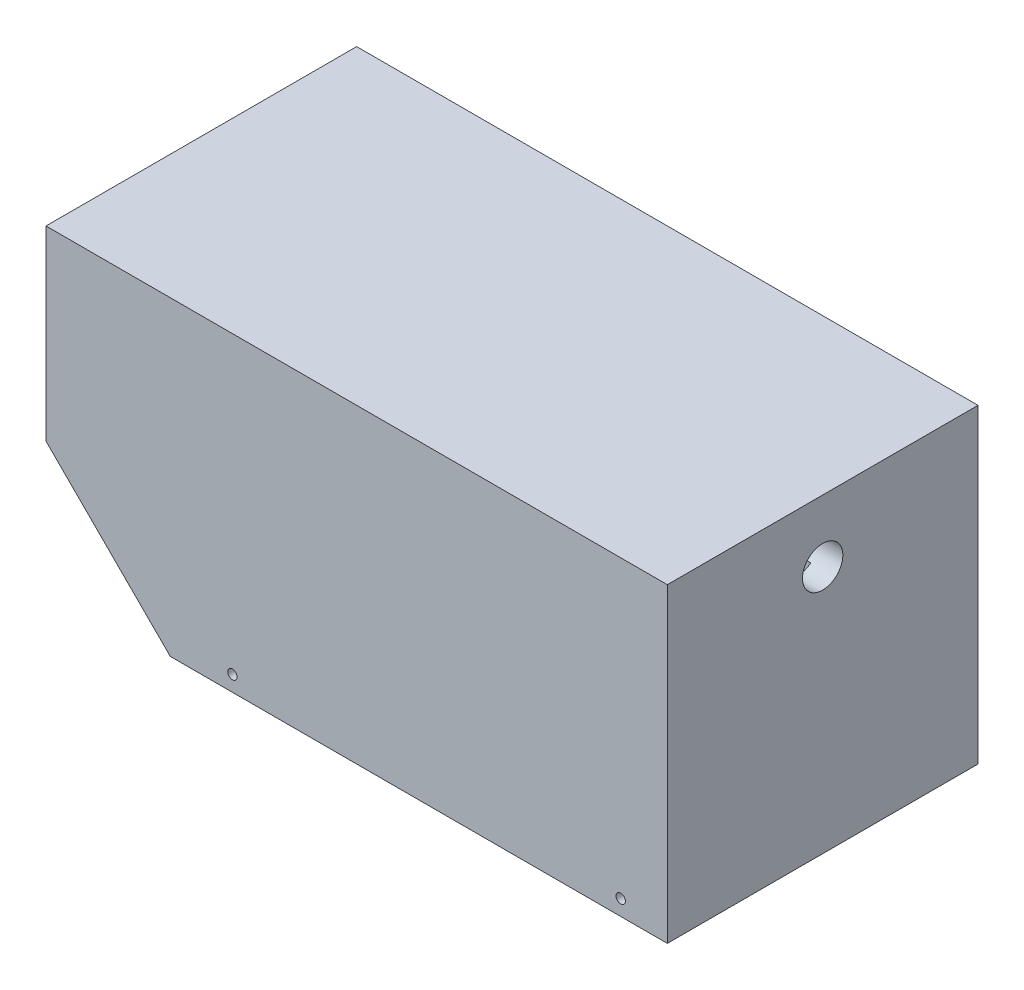
ISO-10303-21;
HEADER;
FILE_DESCRIPTION(('STEP AP214'),'2;1');
FILE_NAME('part.step','',(''),(''),'','','');
FILE_SCHEMA(('AUTOMOTIVE_DESIGN { 1 0 10303 214 1 1 1 1 }'));
ENDSEC;
DATA;
#1=APPLICATION_CONTEXT('core data for automotive mechanical design processes');
#2=APPLICATION_PROTOCOL_DEFINITION('international standard','automotive_design',2000,#1);
#3=PRODUCT_CONTEXT('',#1,'mechanical');
#4=PRODUCT('Part','Part','',(#3));
#5=PRODUCT_RELATED_PRODUCT_CATEGORY('part','',(#4));
#6=PRODUCT_DEFINITION_FORMATION('','',#4);
#7=PRODUCT_DEFINITION_CONTEXT('part definition',#1,'design');
#8=PRODUCT_DEFINITION('design','',#6,#7);
#9=PRODUCT_DEFINITION_SHAPE('','',#8);
#10=(LENGTH_UNIT() NAMED_UNIT(*) SI_UNIT(.MILLI.,.METRE.));
#11=(NAMED_UNIT(*) PLANE_ANGLE_UNIT() SI_UNIT($,.RADIAN.));
#12=(NAMED_UNIT(*) SI_UNIT($,.STERADIAN.) SOLID_ANGLE_UNIT());
#13=UNCERTAINTY_MEASURE_WITH_UNIT(LENGTH_MEASURE(1.E-05),#10,'distance_accuracy_value','');
#14=(GEOMETRIC_REPRESENTATION_CONTEXT(3) GLOBAL_UNCERTAINTY_ASSIGNED_CONTEXT((#13)) GLOBAL_UNIT_ASSIGNED_CONTEXT((#10,
#11,#12)) REPRESENTATION_CONTEXT('',''));
#15=CARTESIAN_POINT('',(0.,0.,0.));
#16=DIRECTION('',(0.,0.,1.));
#17=DIRECTION('',(1.,0.,0.));
#18=AXIS2_PLACEMENT_3D('',#15,#16,#17);
#19=CARTESIAN_POINT('',(-40.,-45.,0.));
#20=DIRECTION('',(0.,0.,1.));
#21=DIRECTION('',(1.,0.,0.));
#22=AXIS2_PLACEMENT_3D('',#19,#20,#21);
#23=CYLINDRICAL_SURFACE('',#22,1.5);
#24=CARTESIAN_POINT('',(-40.,-45.,96.));
#25=DIRECTION('',(0.,0.,1.));
#26=DIRECTION('',(1.,0.,0.));
#27=AXIS2_PLACEMENT_3D('',#24,#25,#26);
#28=CIRCLE('',#27,1.5);
#29=CARTESIAN_POINT('',(-38.5,-45.,96.));
#30=VERTEX_POINT('',#29);
#31=EDGE_CURVE('E208',#30,#30,#28,.F.);
#32=CARTESIAN_POINT('',(-40.,-45.,100.));
#33=DIRECTION('',(0.,0.,1.));
#34=DIRECTION('',(1.,0.,0.));
#35=AXIS2_PLACEMENT_3D('',#32,#33,#34);
#36=CIRCLE('',#35,1.5);
#37=CARTESIAN_POINT('',(-38.5,-45.,100.));
#38=VERTEX_POINT('',#37);
#39=EDGE_CURVE('E228',#38,#38,#36,.T.);
#40=CARTESIAN_POINT('',(-38.5,-45.,96.));
#41=CARTESIAN_POINT('',(-38.5,-45.,96.0416666666667));
#42=CARTESIAN_POINT('',(-38.5,-45.,96.0833333333333));
#43=CARTESIAN_POINT('',(-38.5,-45.,96.1666666666667));
#44=CARTESIAN_POINT('',(-38.5,-45.,96.2083333333333));
#45=CARTESIAN_POINT('',(-38.5,-45.,96.2916666666667));
#46=CARTESIAN_POINT('',(-38.5,-45.,96.3333333333333));
#47=CARTESIAN_POINT('',(-38.5,-45.,96.4166666666667));
#48=CARTESIAN_POINT('',(-38.5,-45.,96.4583333333333));
#49=CARTESIAN_POINT('',(-38.5,-45.,96.5416666666667));
#50=CARTESIAN_POINT('',(-38.5,-45.,96.5833333333333));
#51=CARTESIAN_POINT('',(-38.5,-45.,96.6666666666667));
#52=CARTESIAN_POINT('',(-38.5,-45.,96.7083333333333));
#53=CARTESIAN_POINT('',(-38.5,-45.,96.7916666666667));
#54=CARTESIAN_POINT('',(-38.5,-45.,96.8333333333333));
#55=CARTESIAN_POINT('',(-38.5,-45.,96.9166666666667));
#56=CARTESIAN_POINT('',(-38.5,-45.,96.9583333333333));
#57=CARTESIAN_POINT('',(-38.5,-45.,97.0416666666667));
#58=CARTESIAN_POINT('',(-38.5,-45.,97.0833333333333));
#59=CARTESIAN_POINT('',(-38.5,-45.,97.1666666666667));
#60=CARTESIAN_POINT('',(-38.5,-45.,97.2083333333333));
#61=CARTESIAN_POINT('',(-38.5,-45.,97.2916666666667));
#62=CARTESIAN_POINT('',(-38.5,-45.,97.3333333333333));
#63=CARTESIAN_POINT('',(-38.5,-45.,97.4166666666667));
#64=CARTESIAN_POINT('',(-38.5,-45.,97.4583333333333));
#65=CARTESIAN_POINT('',(-38.5,-45.,97.5416666666667));
#66=CARTESIAN_POINT('',(-38.5,-45.,97.5833333333333));
#67=CARTESIAN_POINT('',(-38.5,-45.,97.6666666666667));
#68=CARTESIAN_POINT('',(-38.5,-45.,97.7083333333333));
#69=CARTESIAN_POINT('',(-38.5,-45.,97.7916666666667));
#70=CARTESIAN_POINT('',(-38.5,-45.,97.8333333333333));
#71=CARTESIAN_POINT('',(-38.5,-45.,97.9166666666667));
#72=CARTESIAN_POINT('',(-38.5,-45.,97.9583333333333));
#73=CARTESIAN_POINT('',(-38.5,-45.,98.0416666666667));
#74=CARTESIAN_POINT('',(-38.5,-45.,98.0833333333333));
#75=CARTESIAN_POINT('',(-38.5,-45.,98.1666666666667));
#76=CARTESIAN_POINT('',(-38.5,-45.,98.2083333333333));
#77=CARTESIAN_POINT('',(-38.5,-45.,98.2916666666667));
#78=CARTESIAN_POINT('',(-38.5,-45.,98.3333333333333));
#79=CARTESIAN_POINT('',(-38.5,-45.,98.4166666666667));
#80=CARTESIAN_POINT('',(-38.5,-45.,98.4583333333333));
#81=CARTESIAN_POINT('',(-38.5,-45.,98.5416666666667));
#82=CARTESIAN_POINT('',(-38.5,-45.,98.5833333333333));
#83=CARTESIAN_POINT('',(-38.5,-45.,98.6666666666667));
#84=CARTESIAN_POINT('',(-38.5,-45.,98.7083333333333));
#85=CARTESIAN_POINT('',(-38.5,-45.,98.7916666666667));
#86=CARTESIAN_POINT('',(-38.5,-45.,98.8333333333333));
#87=CARTESIAN_POINT('',(-38.5,-45.,98.9166666666667));
#88=CARTESIAN_POINT('',(-38.5,-45.,98.9583333333333));
#89=CARTESIAN_POINT('',(-38.5,-45.,99.0416666666667));
#90=CARTESIAN_POINT('',(-38.5,-45.,99.0833333333333));
#91=CARTESIAN_POINT('',(-38.5,-45.,99.1666666666667));
#92=CARTESIAN_POINT('',(-38.5,-45.,99.2083333333333));
#93=CARTESIAN_POINT('',(-38.5,-45.,99.2916666666667));
#94=CARTESIAN_POINT('',(-38.5,-45.,99.3333333333333));
#95=CARTESIAN_POINT('',(-38.5,-45.,99.4166666666667));
#96=CARTESIAN_POINT('',(-38.5,-45.,99.4583333333333));
#97=CARTESIAN_POINT('',(-38.5,-45.,99.5416666666667));
#98=CARTESIAN_POINT('',(-38.5,-45.,99.5833333333333));
#99=CARTESIAN_POINT('',(-38.5,-45.,99.6666666666667));
#100=CARTESIAN_POINT('',(-38.5,-45.,99.7083333333333));
#101=CARTESIAN_POINT('',(-38.5,-45.,99.7916666666667));
#102=CARTESIAN_POINT('',(-38.5,-45.,99.8333333333333));
#103=CARTESIAN_POINT('',(-38.5,-45.,99.9166666666667));
#104=CARTESIAN_POINT('',(-38.5,-45.,99.9583333333333));
#105=CARTESIAN_POINT('',(-38.5,-45.,100.));
#106=B_SPLINE_CURVE_WITH_KNOTS('',3,(#40,#41,#42,#43,#44,#45,#46,#47,#48,#49,#50,#51,#52,#53,
#54,#55,#56,#57,#58,#59,#60,#61,#62,#63,#64,#65,#66,#67,#68,#69,#70,#71,#72,#73,#74,#75,#76,#77,
#78,#79,#80,#81,#82,#83,#84,#85,#86,#87,#88,#89,#90,#91,#92,#93,#94,#95,#96,#97,#98,#99,#100,
#101,#102,#103,#104,#105),.UNSPECIFIED.,.F.,.F.,(4,2,2,2,2,2,2,2,2,2,2,2,2,2,2,2,2,2,2,2,2,2,2,
2,2,2,2,2,2,2,2,2,4),(0.,0.125,0.25,0.375,0.5,0.625000000000001,0.750000000000001,
0.875000000000001,1.,1.125,1.25,1.375,1.5,1.625,1.75,1.875,2.,2.125,2.25,2.375,2.5,2.625,2.75,
2.875,3.,3.125,3.25,3.375,3.5,3.625,3.75,3.875,4.),.UNSPECIFIED.);
#107=EDGE_CURVE('BSEAM49',#30,#38,#106,.T.);
#108=ORIENTED_EDGE('',*,*,#31,.T.);
#109=ORIENTED_EDGE('',*,*,#39,.T.);
#110=ORIENTED_EDGE('',*,*,#107,.T.);
#111=ORIENTED_EDGE('',*,*,#107,.F.);
#112=EDGE_LOOP('',(#108,#110,#109,#111));
#113=FACE_BOUND('',#112,.T.);
#114=ADVANCED_FACE('F49',(#113),#23,.F.);
#115=CARTESIAN_POINT('',(85.,-45.,0.));
#116=DIRECTION('',(0.,0.,1.));
#117=DIRECTION('',(1.,0.,0.));
#118=AXIS2_PLACEMENT_3D('',#115,#116,#117);
#119=CYLINDRICAL_SURFACE('',#118,1.5);
#120=CARTESIAN_POINT('',(85.,-45.,96.));
#121=DIRECTION('',(0.,0.,1.));
#122=DIRECTION('',(1.,0.,0.));
#123=AXIS2_PLACEMENT_3D('',#120,#121,#122);
#124=CIRCLE('',#123,1.5);
#125=CARTESIAN_POINT('',(86.5,-45.,96.));
#126=VERTEX_POINT('',#125);
#127=EDGE_CURVE('E205',#126,#126,#124,.F.);
#128=CARTESIAN_POINT('',(85.,-45.,100.));
#129=DIRECTION('',(0.,0.,1.));
#130=DIRECTION('',(1.,0.,0.));
#131=AXIS2_PLACEMENT_3D('',#128,#129,#130);
#132=CIRCLE('',#131,1.5);
#133=CARTESIAN_POINT('',(86.5,-45.,100.));
#134=VERTEX_POINT('',#133);
#135=EDGE_CURVE('E241',#134,#134,#132,.T.);
#136=CARTESIAN_POINT('',(86.5,-45.,96.));
#137=CARTESIAN_POINT('',(86.5,-45.,96.0416666666667));
#138=CARTESIAN_POINT('',(86.5,-45.,96.0833333333333));
#139=CARTESIAN_POINT('',(86.5,-45.,96.1666666666667));
#140=CARTESIAN_POINT('',(86.5,-45.,96.2083333333333));
#141=CARTESIAN_POINT('',(86.5,-45.,96.2916666666667));
#142=CARTESIAN_POINT('',(86.5,-45.,96.3333333333333));
#143=CARTESIAN_POINT('',(86.5,-45.,96.4166666666667));
#144=CARTESIAN_POINT('',(86.5,-45.,96.4583333333333));
#145=CARTESIAN_POINT('',(86.5,-45.,96.5416666666667));
#146=CARTESIAN_POINT('',(86.5,-45.,96.5833333333333));
#147=CARTESIAN_POINT('',(86.5,-45.,96.6666666666667));
#148=CARTESIAN_POINT('',(86.5,-45.,96.7083333333333));
#149=CARTESIAN_POINT('',(86.5,-45.,96.7916666666667));
#150=CARTESIAN_POINT('',(86.5,-45.,96.8333333333333));
#151=CARTESIAN_POINT('',(86.5,-45.,96.9166666666667));
#152=CARTESIAN_POINT('',(86.5,-45.,96.9583333333333));
#153=CARTESIAN_POINT('',(86.5,-45.,97.0416666666667));
#154=CARTESIAN_POINT('',(86.5,-45.,97.0833333333333));
#155=CARTESIAN_POINT('',(86.5,-45.,97.1666666666667));
#156=CARTESIAN_POINT('',(86.5,-45.,97.2083333333333));
#157=CARTESIAN_POINT('',(86.5,-45.,97.2916666666667));
#158=CARTESIAN_POINT('',(86.5,-45.,97.3333333333333));
#159=CARTESIAN_POINT('',(86.5,-45.,97.4166666666667));
#160=CARTESIAN_POINT('',(86.5,-45.,97.4583333333333));
#161=CARTESIAN_POINT('',(86.5,-45.,97.5416666666667));
#162=CARTESIAN_POINT('',(86.5,-45.,97.5833333333333));
#163=CARTESIAN_POINT('',(86.5,-45.,97.6666666666667));
#164=CARTESIAN_POINT('',(86.5,-45.,97.7083333333333));
#165=CARTESIAN_POINT('',(86.5,-45.,97.7916666666667));
#166=CARTESIAN_POINT('',(86.5,-45.,97.8333333333333));
#167=CARTESIAN_POINT('',(86.5,-45.,97.9166666666667));
#168=CARTESIAN_POINT('',(86.5,-45.,97.9583333333333));
#169=CARTESIAN_POINT('',(86.5,-45.,98.0416666666667));
#170=CARTESIAN_POINT('',(86.5,-45.,98.0833333333333));
#171=CARTESIAN_POINT('',(86.5,-45.,98.1666666666667));
#172=CARTESIAN_POINT('',(86.5,-45.,98.2083333333333));
#173=CARTESIAN_POINT('',(86.5,-45.,98.2916666666667));
#174=CARTESIAN_POINT('',(86.5,-45.,98.3333333333333));
#175=CARTESIAN_POINT('',(86.5,-45.,98.4166666666667));
#176=CARTESIAN_POINT('',(86.5,-45.,98.4583333333333));
#177=CARTESIAN_POINT('',(86.5,-45.,98.5416666666667));
#178=CARTESIAN_POINT('',(86.5,-45.,98.5833333333333));
#179=CARTESIAN_POINT('',(86.5,-45.,98.6666666666667));
#180=CARTESIAN_POINT('',(86.5,-45.,98.7083333333333));
#181=CARTESIAN_POINT('',(86.5,-45.,98.7916666666667));
#182=CARTESIAN_POINT('',(86.5,-45.,98.8333333333333));
#183=CARTESIAN_POINT('',(86.5,-45.,98.9166666666667));
#184=CARTESIAN_POINT('',(86.5,-45.,98.9583333333333));
#185=CARTESIAN_POINT('',(86.5,-45.,99.0416666666667));
#186=CARTESIAN_POINT('',(86.5,-45.,99.0833333333333));
#187=CARTESIAN_POINT('',(86.5,-45.,99.1666666666667));
#188=CARTESIAN_POINT('',(86.5,-45.,99.2083333333333));
#189=CARTESIAN_POINT('',(86.5,-45.,99.2916666666667));
#190=CARTESIAN_POINT('',(86.5,-45.,99.3333333333333));
#191=CARTESIAN_POINT('',(86.5,-45.,99.4166666666667));
#192=CARTESIAN_POINT('',(86.5,-45.,99.4583333333333));
#193=CARTESIAN_POINT('',(86.5,-45.,99.5416666666667));
#194=CARTESIAN_POINT('',(86.5,-45.,99.5833333333333));
#195=CARTESIAN_POINT('',(86.5,-45.,99.6666666666667));
#196=CARTESIAN_POINT('',(86.5,-45.,99.7083333333333));
#197=CARTESIAN_POINT('',(86.5,-45.,99.7916666666667));
#198=CARTESIAN_POINT('',(86.5,-45.,99.8333333333333));
#199=CARTESIAN_POINT('',(86.5,-45.,99.9166666666667));
#200=CARTESIAN_POINT('',(86.5,-45.,99.9583333333333));
#201=CARTESIAN_POINT('',(86.5,-45.,100.));
#202=B_SPLINE_CURVE_WITH_KNOTS('',3,(#136,#137,#138,#139,#140,#141,#142,#143,#144,#145,#146,
#147,#148,#149,#150,#151,#152,#153,#154,#155,#156,#157,#158,#159,#160,#161,#162,#163,#164,#165,
#166,#167,#168,#169,#170,#171,#172,#173,#174,#175,#176,#177,#178,#179,#180,#181,#182,#183,#184,
#185,#186,#187,#188,#189,#190,#191,#192,#193,#194,#195,#196,#197,#198,#199,#200,#201),
.UNSPECIFIED.,.F.,.F.,(4,2,2,2,2,2,2,2,2,2,2,2,2,2,2,2,2,2,2,2,2,2,2,2,2,2,2,2,2,2,2,2,4),(0.,
0.125,0.25,0.375,0.5,0.625000000000001,0.750000000000001,0.875000000000001,1.,1.125,1.25,1.375,
1.5,1.625,1.75,1.875,2.,2.125,2.25,2.375,2.5,2.625,2.75,2.875,3.,3.125,3.25,3.375,3.5,3.625,
3.75,3.875,4.),.UNSPECIFIED.);
#203=EDGE_CURVE('BSEAM337',#126,#134,#202,.T.);
#204=ORIENTED_EDGE('',*,*,#127,.T.);
#205=ORIENTED_EDGE('',*,*,#135,.T.);
#206=ORIENTED_EDGE('',*,*,#203,.T.);
#207=ORIENTED_EDGE('',*,*,#203,.F.);
#208=EDGE_LOOP('',(#204,#206,#205,#207));
#209=FACE_BOUND('',#208,.T.);
#210=ADVANCED_FACE('F337',(#209),#119,.F.);
#211=CARTESIAN_POINT('',(-100.,-50.,100.));
#212=DIRECTION('',(1.,0.,0.));
#213=DIRECTION('',(0.,0.,-1.));
#214=AXIS2_PLACEMENT_3D('',#211,#212,#213);
#215=PLANE('',#214);
#216=CARTESIAN_POINT('',(-100.,30.,50.));
#217=DIRECTION('',(1.,0.,0.));
#218=DIRECTION('',(0.,0.,-1.));
#219=AXIS2_PLACEMENT_3D('',#216,#217,#218);
#220=CIRCLE('',#219,6.5);
#221=CARTESIAN_POINT('',(-100.,30.,43.5));
#222=VERTEX_POINT('',#221);
#223=EDGE_CURVE('E249',#222,#222,#220,.T.);
#224=ORIENTED_EDGE('',*,*,#223,.T.);
#225=EDGE_LOOP('',(#224));
#226=FACE_BOUND('',#225,.T.);
#227=DIRECTION('',(0.,-1.,0.));
#228=VECTOR('',#227,1.);
#229=CARTESIAN_POINT('',(-100.,-50.,0.));
#230=LINE('',#229,#228);
#231=CARTESIAN_POINT('',(-100.,50.,0.));
#232=VERTEX_POINT('',#231);
#233=CARTESIAN_POINT('',(-100.,-9.99999999999991,0.));
#234=VERTEX_POINT('',#233);
#235=EDGE_CURVE('E252',#232,#234,#230,.T.);
#236=ORIENTED_EDGE('',*,*,#235,.T.);
#237=DIRECTION('',(0.,0.,1.));
#238=VECTOR('',#237,1.);
#239=CARTESIAN_POINT('',(-100.,-9.99999999999991,100.));
#240=LINE('',#239,#238);
#241=CARTESIAN_POINT('',(-100.,-9.99999999999991,100.));
#242=VERTEX_POINT('',#241);
#243=EDGE_CURVE('E286',#234,#242,#240,.T.);
#244=ORIENTED_EDGE('',*,*,#243,.T.);
#245=DIRECTION('',(0.,-1.,0.));
#246=VECTOR('',#245,1.);
#247=CARTESIAN_POINT('',(-100.,-50.,100.));
#248=LINE('',#247,#246);
#249=CARTESIAN_POINT('',(-100.,50.,100.));
#250=VERTEX_POINT('',#249);
#251=EDGE_CURVE('E255',#250,#242,#248,.T.);
#252=ORIENTED_EDGE('',*,*,#251,.F.);
#253=DIRECTION('',(0.,0.,-1.));
#254=VECTOR('',#253,1.);
#255=CARTESIAN_POINT('',(-100.,50.,100.));
#256=LINE('',#255,#254);
#257=EDGE_CURVE('E265',#250,#232,#256,.T.);
#258=ORIENTED_EDGE('',*,*,#257,.T.);
#259=EDGE_LOOP('',(#236,#244,#252,#258));
#260=FACE_BOUND('',#259,.T.);
#261=ADVANCED_FACE('F344',(#226,#260),#215,.F.);
#262=CARTESIAN_POINT('',(100.,-50.,100.));
#263=DIRECTION('',(0.,1.,0.));
#264=DIRECTION('',(-1.,0.,0.));
#265=AXIS2_PLACEMENT_3D('',#262,#263,#264);
#266=PLANE('',#265);
#267=DIRECTION('',(1.,0.,0.));
#268=VECTOR('',#267,1.);
#269=CARTESIAN_POINT('',(-56.,-50.,4.));
#270=LINE('',#269,#268);
#271=CARTESIAN_POINT('',(-56.,-50.,4.));
#272=VERTEX_POINT('',#271);
#273=CARTESIAN_POINT('',(96.,-50.,4.));
#274=VERTEX_POINT('',#273);
#275=EDGE_CURVE('E186',#272,#274,#270,.T.);
#276=ORIENTED_EDGE('',*,*,#275,.F.);
#277=DIRECTION('',(0.,0.,-1.));
#278=VECTOR('',#277,1.);
#279=CARTESIAN_POINT('',(-56.,-50.,4.));
#280=LINE('',#279,#278);
#281=CARTESIAN_POINT('',(-56.,-50.,96.));
#282=VERTEX_POINT('',#281);
#283=EDGE_CURVE('E65',#282,#272,#280,.T.);
#284=ORIENTED_EDGE('',*,*,#283,.F.);
#285=DIRECTION('',(-1.,0.,0.));
#286=VECTOR('',#285,1.);
#287=CARTESIAN_POINT('',(-56.,-50.,96.));
#288=LINE('',#287,#286);
#289=CARTESIAN_POINT('',(96.,-50.,96.));
#290=VERTEX_POINT('',#289);
#291=EDGE_CURVE('E177',#290,#282,#288,.T.);
#292=ORIENTED_EDGE('',*,*,#291,.F.);
#293=DIRECTION('',(0.,0.,1.));
#294=VECTOR('',#293,1.);
#295=CARTESIAN_POINT('',(96.,-50.,4.));
#296=LINE('',#295,#294);
#297=EDGE_CURVE('E180',#274,#290,#296,.T.);
#298=ORIENTED_EDGE('',*,*,#297,.F.);
#299=EDGE_LOOP('',(#276,#284,#292,#298));
#300=FACE_BOUND('',#299,.T.);
#301=DIRECTION('',(1.,0.,0.));
#302=VECTOR('',#301,1.);
#303=CARTESIAN_POINT('',(100.,-50.,100.));
#304=LINE('',#303,#302);
#305=CARTESIAN_POINT('',(-60.,-50.,100.));
#306=VERTEX_POINT('',#305);
#307=CARTESIAN_POINT('',(100.,-50.,100.));
#308=VERTEX_POINT('',#307);
#309=EDGE_CURVE('E258',#306,#308,#304,.T.);
#310=ORIENTED_EDGE('',*,*,#309,.F.);
#311=DIRECTION('',(0.,0.,-1.));
#312=VECTOR('',#311,1.);
#313=CARTESIAN_POINT('',(-60.,-50.,100.));
#314=LINE('',#313,#312);
#315=CARTESIAN_POINT('',(-60.,-50.,0.));
#316=VERTEX_POINT('',#315);
#317=EDGE_CURVE('E281',#306,#316,#314,.T.);
#318=ORIENTED_EDGE('',*,*,#317,.T.);
#319=DIRECTION('',(1.,0.,0.));
#320=VECTOR('',#319,1.);
#321=CARTESIAN_POINT('',(100.,-50.,0.));
#322=LINE('',#321,#320);
#323=CARTESIAN_POINT('',(100.,-50.,0.));
#324=VERTEX_POINT('',#323);
#325=EDGE_CURVE('E268',#316,#324,#322,.T.);
#326=ORIENTED_EDGE('',*,*,#325,.T.);
#327=DIRECTION('',(0.,0.,-1.));
#328=VECTOR('',#327,1.);
#329=CARTESIAN_POINT('',(100.,-50.,100.));
#330=LINE('',#329,#328);
#331=EDGE_CURVE('E278',#308,#324,#330,.T.);
#332=ORIENTED_EDGE('',*,*,#331,.F.);
#333=EDGE_LOOP('',(#310,#318,#326,#332));
#334=FACE_BOUND('',#333,.T.);
#335=ADVANCED_FACE('F374',(#300,#334),#266,.F.);
#336=CARTESIAN_POINT('',(100.,-50.,100.));
#337=DIRECTION('',(-1.,0.,0.));
#338=DIRECTION('',(0.,0.,1.));
#339=AXIS2_PLACEMENT_3D('',#336,#337,#338);
#340=PLANE('',#339);
#341=CARTESIAN_POINT('',(100.,30.,50.));
#342=DIRECTION('',(1.,0.,0.));
#343=DIRECTION('',(0.,0.,-1.));
#344=AXIS2_PLACEMENT_3D('',#341,#342,#343);
#345=CIRCLE('',#344,6.5);
#346=CARTESIAN_POINT('',(100.,30.,43.5));
#347=VERTEX_POINT('',#346);
#348=EDGE_CURVE('E240',#347,#347,#345,.T.);
#349=ORIENTED_EDGE('',*,*,#348,.F.);
#350=EDGE_LOOP('',(#349));
#351=FACE_BOUND('',#350,.T.);
#352=DIRECTION('',(0.,1.,0.));
#353=VECTOR('',#352,1.);
#354=CARTESIAN_POINT('',(100.,-50.,0.));
#355=LINE('',#354,#353);
#356=CARTESIAN_POINT('',(100.,50.,0.));
#357=VERTEX_POINT('',#356);
#358=EDGE_CURVE('E270',#324,#357,#355,.T.);
#359=ORIENTED_EDGE('',*,*,#358,.T.);
#360=DIRECTION('',(0.,0.,-1.));
#361=VECTOR('',#360,1.);
#362=CARTESIAN_POINT('',(100.,50.,100.));
#363=LINE('',#362,#361);
#364=CARTESIAN_POINT('',(100.,50.,100.));
#365=VERTEX_POINT('',#364);
#366=EDGE_CURVE('E275',#365,#357,#363,.T.);
#367=ORIENTED_EDGE('',*,*,#366,.F.);
#368=DIRECTION('',(0.,1.,0.));
#369=VECTOR('',#368,1.);
#370=CARTESIAN_POINT('',(100.,-50.,100.));
#371=LINE('',#370,#369);
#372=EDGE_CURVE('E261',#308,#365,#371,.T.);
#373=ORIENTED_EDGE('',*,*,#372,.F.);
#374=ORIENTED_EDGE('',*,*,#331,.T.);
#375=EDGE_LOOP('',(#359,#367,#373,#374));
#376=FACE_BOUND('',#375,.T.);
#377=ADVANCED_FACE('F378',(#351,#376),#340,.F.);
#378=CARTESIAN_POINT('',(100.,50.,100.));
#379=DIRECTION('',(0.,-1.,0.));
#380=DIRECTION('',(1.,0.,0.));
#381=AXIS2_PLACEMENT_3D('',#378,#379,#380);
#382=PLANE('',#381);
#383=DIRECTION('',(-1.,0.,0.));
#384=VECTOR('',#383,1.);
#385=CARTESIAN_POINT('',(100.,50.,0.));
#386=LINE('',#385,#384);
#387=EDGE_CURVE('E259',#357,#232,#386,.T.);
#388=ORIENTED_EDGE('',*,*,#387,.T.);
#389=ORIENTED_EDGE('',*,*,#257,.F.);
#390=DIRECTION('',(-1.,0.,0.));
#391=VECTOR('',#390,1.);
#392=CARTESIAN_POINT('',(100.,50.,100.));
#393=LINE('',#392,#391);
#394=EDGE_CURVE('E263',#365,#250,#393,.T.);
#395=ORIENTED_EDGE('',*,*,#394,.F.);
#396=ORIENTED_EDGE('',*,*,#366,.T.);
#397=EDGE_LOOP('',(#388,#389,#395,#396));
#398=FACE_BOUND('',#397,.T.);
#399=ADVANCED_FACE('F389',(#398),#382,.F.);
#400=CARTESIAN_POINT('',(0.,0.,100.));
#401=DIRECTION('',(0.,0.,1.));
#402=DIRECTION('',(1.,0.,0.));
#403=AXIS2_PLACEMENT_3D('',#400,#401,#402);
#404=PLANE('',#403);
#405=ORIENTED_EDGE('',*,*,#135,.F.);
#406=EDGE_LOOP('',(#405));
#407=FACE_BOUND('',#406,.T.);
#408=ORIENTED_EDGE('',*,*,#39,.F.);
#409=EDGE_LOOP('',(#408));
#410=FACE_BOUND('',#409,.T.);
#411=ORIENTED_EDGE('',*,*,#251,.T.);
#412=DIRECTION('',(-0.707106781186547,0.707106781186549,0.));
#413=VECTOR('',#412,1.);
#414=CARTESIAN_POINT('',(-55.0000000000001,-54.9999999999999,100.));
#415=LINE('',#414,#413);
#416=EDGE_CURVE('E288',#242,#306,#415,.F.);
#417=ORIENTED_EDGE('',*,*,#416,.T.);
#418=ORIENTED_EDGE('',*,*,#309,.T.);
#419=ORIENTED_EDGE('',*,*,#372,.T.);
#420=ORIENTED_EDGE('',*,*,#394,.T.);
#421=EDGE_LOOP('',(#411,#417,#418,#419,#420));
#422=FACE_BOUND('',#421,.T.);
#423=ADVANCED_FACE('F364',(#407,#410,#422),#404,.T.);
#424=CARTESIAN_POINT('',(0.,0.,0.));
#425=DIRECTION('',(0.,0.,1.));
#426=DIRECTION('',(1.,0.,0.));
#427=AXIS2_PLACEMENT_3D('',#424,#425,#426);
#428=PLANE('',#427);
#429=CARTESIAN_POINT('',(85.,-45.,0.));
#430=DIRECTION('',(0.,0.,1.));
#431=DIRECTION('',(1.,0.,0.));
#432=AXIS2_PLACEMENT_3D('',#429,#430,#431);
#433=CIRCLE('',#432,1.5);
#434=CARTESIAN_POINT('',(86.5,-45.,0.));
#435=VERTEX_POINT('',#434);
#436=EDGE_CURVE('E237',#435,#435,#433,.T.);
#437=ORIENTED_EDGE('',*,*,#436,.T.);
#438=EDGE_LOOP('',(#437));
#439=FACE_BOUND('',#438,.T.);
#440=CARTESIAN_POINT('',(-40.,-45.,0.));
#441=DIRECTION('',(0.,0.,1.));
#442=DIRECTION('',(1.,0.,0.));
#443=AXIS2_PLACEMENT_3D('',#440,#441,#442);
#444=CIRCLE('',#443,1.5);
#445=CARTESIAN_POINT('',(-38.5,-45.,0.));
#446=VERTEX_POINT('',#445);
#447=EDGE_CURVE('E244',#446,#446,#444,.T.);
#448=ORIENTED_EDGE('',*,*,#447,.T.);
#449=EDGE_LOOP('',(#448));
#450=FACE_BOUND('',#449,.T.);
#451=ORIENTED_EDGE('',*,*,#325,.F.);
#452=DIRECTION('',(0.707106781186547,-0.707106781186549,0.));
#453=VECTOR('',#452,1.);
#454=CARTESIAN_POINT('',(-60.,-50.,0.));
#455=LINE('',#454,#453);
#456=EDGE_CURVE('E284',#316,#234,#455,.F.);
#457=ORIENTED_EDGE('',*,*,#456,.T.);
#458=ORIENTED_EDGE('',*,*,#235,.F.);
#459=ORIENTED_EDGE('',*,*,#387,.F.);
#460=ORIENTED_EDGE('',*,*,#358,.F.);
#461=EDGE_LOOP('',(#451,#457,#458,#459,#460));
#462=FACE_BOUND('',#461,.T.);
#463=ADVANCED_FACE('F361',(#439,#450,#462),#428,.F.);
#464=CARTESIAN_POINT('',(-60.,-50.,100.));
#465=DIRECTION('',(0.707106781186549,0.707106781186547,0.));
#466=DIRECTION('',(0.,0.,-1.));
#467=AXIS2_PLACEMENT_3D('',#464,#465,#466);
#468=PLANE('',#467);
#469=ORIENTED_EDGE('',*,*,#416,.F.);
#470=ORIENTED_EDGE('',*,*,#243,.F.);
#471=ORIENTED_EDGE('',*,*,#456,.F.);
#472=ORIENTED_EDGE('',*,*,#317,.F.);
#473=EDGE_LOOP('',(#469,#470,#471,#472));
#474=FACE_BOUND('',#473,.T.);
#475=ADVANCED_FACE('F51',(#474),#468,.F.);
#476=CARTESIAN_POINT('',(-100.,30.,50.));
#477=DIRECTION('',(1.,0.,0.));
#478=DIRECTION('',(0.,0.,-1.));
#479=AXIS2_PLACEMENT_3D('',#476,#477,#478);
#480=CYLINDRICAL_SURFACE('',#479,6.5);
#481=CARTESIAN_POINT('',(92.,30.,50.));
#482=DIRECTION('',(1.,0.,0.));
#483=DIRECTION('',(0.,1.,0.));
#484=AXIS2_PLACEMENT_3D('',#481,#482,#483);
#485=CIRCLE('',#484,6.5);
#486=CARTESIAN_POINT('',(92.,25.,45.846688068541));
#487=VERTEX_POINT('',#486);
#488=CARTESIAN_POINT('',(92.,25.,54.153311931459));
#489=VERTEX_POINT('',#488);
#490=EDGE_CURVE('E293',#487,#489,#485,.F.);
#491=ORIENTED_EDGE('',*,*,#490,.T.);
#492=DIRECTION('',(1.,0.,0.));
#493=VECTOR('',#492,1.);
#494=CARTESIAN_POINT('',(-100.,25.,54.153311931459));
#495=LINE('',#494,#493);
#496=CARTESIAN_POINT('',(-52.,25.,54.153311931459));
#497=VERTEX_POINT('',#496);
#498=EDGE_CURVE('E58',#489,#497,#495,.F.);
#499=ORIENTED_EDGE('',*,*,#498,.T.);
#500=CARTESIAN_POINT('',(-52.,30.,50.));
#501=DIRECTION('',(-1.,0.,0.));
#502=DIRECTION('',(0.,-1.,0.));
#503=AXIS2_PLACEMENT_3D('',#500,#501,#502);
#504=CIRCLE('',#503,6.5);
#505=CARTESIAN_POINT('',(-52.,25.,45.846688068541));
#506=VERTEX_POINT('',#505);
#507=EDGE_CURVE('E296',#497,#506,#504,.F.);
#508=ORIENTED_EDGE('',*,*,#507,.T.);
#509=DIRECTION('',(1.,0.,0.));
#510=VECTOR('',#509,1.);
#511=CARTESIAN_POINT('',(-100.,25.,45.846688068541));
#512=LINE('',#511,#510);
#513=EDGE_CURVE('E290',#506,#487,#512,.T.);
#514=ORIENTED_EDGE('',*,*,#513,.T.);
#515=EDGE_LOOP('',(#491,#499,#508,#514));
#516=FACE_BOUND('',#515,.T.);
#517=ORIENTED_EDGE('',*,*,#223,.F.);
#518=EDGE_LOOP('',(#517));
#519=FACE_BOUND('',#518,.T.);
#520=ORIENTED_EDGE('',*,*,#348,.T.);
#521=EDGE_LOOP('',(#520));
#522=FACE_BOUND('',#521,.T.);
#523=ADVANCED_FACE('F301',(#516,#519,#522),#480,.F.);
#524=CARTESIAN_POINT('',(-40.,-45.,4.));
#525=DIRECTION('',(0.,0.,-1.));
#526=DIRECTION('',(-1.,0.,0.));
#527=AXIS2_PLACEMENT_3D('',#524,#525,#526);
#528=CIRCLE('',#527,1.5);
#529=CARTESIAN_POINT('',(-38.5,-45.,4.));
#530=VERTEX_POINT('',#529);
#531=EDGE_CURVE('E202',#530,#530,#528,.F.);
#532=CARTESIAN_POINT('',(-38.5,-45.,4.));
#533=CARTESIAN_POINT('',(-38.5,-45.,3.95833333333333));
#534=CARTESIAN_POINT('',(-38.5,-45.,3.91666666666667));
#535=CARTESIAN_POINT('',(-38.5,-45.,3.83333333333333));
#536=CARTESIAN_POINT('',(-38.5,-45.,3.79166666666667));
#537=CARTESIAN_POINT('',(-38.5,-45.,3.70833333333333));
#538=CARTESIAN_POINT('',(-38.5,-45.,3.66666666666667));
#539=CARTESIAN_POINT('',(-38.5,-45.,3.58333333333333));
#540=CARTESIAN_POINT('',(-38.5,-45.,3.54166666666667));
#541=CARTESIAN_POINT('',(-38.5,-45.,3.45833333333333));
#542=CARTESIAN_POINT('',(-38.5,-45.,3.41666666666667));
#543=CARTESIAN_POINT('',(-38.5,-45.,3.33333333333333));
#544=CARTESIAN_POINT('',(-38.5,-45.,3.29166666666667));
#545=CARTESIAN_POINT('',(-38.5,-45.,3.20833333333333));
#546=CARTESIAN_POINT('',(-38.5,-45.,3.16666666666667));
#547=CARTESIAN_POINT('',(-38.5,-45.,3.08333333333333));
#548=CARTESIAN_POINT('',(-38.5,-45.,3.04166666666667));
#549=CARTESIAN_POINT('',(-38.5,-45.,2.95833333333333));
#550=CARTESIAN_POINT('',(-38.5,-45.,2.91666666666667));
#551=CARTESIAN_POINT('',(-38.5,-45.,2.83333333333333));
#552=CARTESIAN_POINT('',(-38.5,-45.,2.79166666666667));
#553=CARTESIAN_POINT('',(-38.5,-45.,2.70833333333333));
#554=CARTESIAN_POINT('',(-38.5,-45.,2.66666666666667));
#555=CARTESIAN_POINT('',(-38.5,-45.,2.58333333333333));
#556=CARTESIAN_POINT('',(-38.5,-45.,2.54166666666667));
#557=CARTESIAN_POINT('',(-38.5,-45.,2.45833333333333));
#558=CARTESIAN_POINT('',(-38.5,-45.,2.41666666666667));
#559=CARTESIAN_POINT('',(-38.5,-45.,2.33333333333333));
#560=CARTESIAN_POINT('',(-38.5,-45.,2.29166666666667));
#561=CARTESIAN_POINT('',(-38.5,-45.,2.20833333333333));
#562=CARTESIAN_POINT('',(-38.5,-45.,2.16666666666667));
#563=CARTESIAN_POINT('',(-38.5,-45.,2.08333333333333));
#564=CARTESIAN_POINT('',(-38.5,-45.,2.04166666666667));
#565=CARTESIAN_POINT('',(-38.5,-45.,1.95833333333333));
#566=CARTESIAN_POINT('',(-38.5,-45.,1.91666666666667));
#567=CARTESIAN_POINT('',(-38.5,-45.,1.83333333333333));
#568=CARTESIAN_POINT('',(-38.5,-45.,1.79166666666667));
#569=CARTESIAN_POINT('',(-38.5,-45.,1.70833333333333));
#570=CARTESIAN_POINT('',(-38.5,-45.,1.66666666666667));
#571=CARTESIAN_POINT('',(-38.5,-45.,1.58333333333333));
#572=CARTESIAN_POINT('',(-38.5,-45.,1.54166666666667));
#573=CARTESIAN_POINT('',(-38.5,-45.,1.45833333333333));
#574=CARTESIAN_POINT('',(-38.5,-45.,1.41666666666667));
#575=CARTESIAN_POINT('',(-38.5,-45.,1.33333333333333));
#576=CARTESIAN_POINT('',(-38.5,-45.,1.29166666666667));
#577=CARTESIAN_POINT('',(-38.5,-45.,1.20833333333333));
#578=CARTESIAN_POINT('',(-38.5,-45.,1.16666666666667));
#579=CARTESIAN_POINT('',(-38.5,-45.,1.08333333333333));
#580=CARTESIAN_POINT('',(-38.5,-45.,1.04166666666667));
#581=CARTESIAN_POINT('',(-38.5,-45.,0.958333333333334));
#582=CARTESIAN_POINT('',(-38.5,-45.,0.916666666666667));
#583=CARTESIAN_POINT('',(-38.5,-45.,0.833333333333333));
#584=CARTESIAN_POINT('',(-38.5,-45.,0.791666666666667));
#585=CARTESIAN_POINT('',(-38.5,-45.,0.708333333333333));
#586=CARTESIAN_POINT('',(-38.5,-45.,0.666666666666667));
#587=CARTESIAN_POINT('',(-38.5,-45.,0.583333333333333));
#588=CARTESIAN_POINT('',(-38.5,-45.,0.541666666666667));
#589=CARTESIAN_POINT('',(-38.5,-45.,0.458333333333334));
#590=CARTESIAN_POINT('',(-38.5,-45.,0.416666666666667));
#591=CARTESIAN_POINT('',(-38.5,-45.,0.333333333333334));
#592=CARTESIAN_POINT('',(-38.5,-45.,0.291666666666667));
#593=CARTESIAN_POINT('',(-38.5,-45.,0.208333333333333));
#594=CARTESIAN_POINT('',(-38.5,-45.,0.166666666666667));
#595=CARTESIAN_POINT('',(-38.5,-45.,0.0833333333333334));
#596=CARTESIAN_POINT('',(-38.5,-45.,0.0416666666666667));
#597=CARTESIAN_POINT('',(-38.5,-45.,0.));
#598=B_SPLINE_CURVE_WITH_KNOTS('',3,(#532,#533,#534,#535,#536,#537,#538,#539,#540,#541,#542,
#543,#544,#545,#546,#547,#548,#549,#550,#551,#552,#553,#554,#555,#556,#557,#558,#559,#560,#561,
#562,#563,#564,#565,#566,#567,#568,#569,#570,#571,#572,#573,#574,#575,#576,#577,#578,#579,#580,
#581,#582,#583,#584,#585,#586,#587,#588,#589,#590,#591,#592,#593,#594,#595,#596,#597),
.UNSPECIFIED.,.F.,.F.,(4,2,2,2,2,2,2,2,2,2,2,2,2,2,2,2,2,2,2,2,2,2,2,2,2,2,2,2,2,2,2,2,4),(0.,
0.125,0.25,0.375,0.5,0.625,0.75,0.875,1.,1.125,1.25,1.375,1.5,1.625,1.75,1.875,2.,2.125,2.25,
2.375,2.5,2.625,2.75,2.875,3.,3.125,3.25,3.375,3.5,3.625,3.75,3.875,4.),.UNSPECIFIED.);
#599=EDGE_CURVE('BSEAM340',#530,#446,#598,.T.);
#600=ORIENTED_EDGE('',*,*,#531,.T.);
#601=ORIENTED_EDGE('',*,*,#447,.F.);
#602=ORIENTED_EDGE('',*,*,#599,.T.);
#603=ORIENTED_EDGE('',*,*,#599,.F.);
#604=EDGE_LOOP('',(#600,#602,#601,#603));
#605=FACE_BOUND('',#604,.T.);
#606=ADVANCED_FACE('F340',(#605),#23,.F.);
#607=CARTESIAN_POINT('',(85.,-45.,4.));
#608=DIRECTION('',(0.,0.,-1.));
#609=DIRECTION('',(-1.,0.,0.));
#610=AXIS2_PLACEMENT_3D('',#607,#608,#609);
#611=CIRCLE('',#610,1.5);
#612=CARTESIAN_POINT('',(86.5,-45.,4.));
#613=VERTEX_POINT('',#612);
#614=EDGE_CURVE('E53',#613,#613,#611,.F.);
#615=CARTESIAN_POINT('',(86.5,-45.,4.));
#616=CARTESIAN_POINT('',(86.5,-45.,3.95833333333333));
#617=CARTESIAN_POINT('',(86.5,-45.,3.91666666666667));
#618=CARTESIAN_POINT('',(86.5,-45.,3.83333333333333));
#619=CARTESIAN_POINT('',(86.5,-45.,3.79166666666667));
#620=CARTESIAN_POINT('',(86.5,-45.,3.70833333333333));
#621=CARTESIAN_POINT('',(86.5,-45.,3.66666666666667));
#622=CARTESIAN_POINT('',(86.5,-45.,3.58333333333333));
#623=CARTESIAN_POINT('',(86.5,-45.,3.54166666666667));
#624=CARTESIAN_POINT('',(86.5,-45.,3.45833333333333));
#625=CARTESIAN_POINT('',(86.5,-45.,3.41666666666667));
#626=CARTESIAN_POINT('',(86.5,-45.,3.33333333333333));
#627=CARTESIAN_POINT('',(86.5,-45.,3.29166666666667));
#628=CARTESIAN_POINT('',(86.5,-45.,3.20833333333333));
#629=CARTESIAN_POINT('',(86.5,-45.,3.16666666666667));
#630=CARTESIAN_POINT('',(86.5,-45.,3.08333333333333));
#631=CARTESIAN_POINT('',(86.5,-45.,3.04166666666667));
#632=CARTESIAN_POINT('',(86.5,-45.,2.95833333333333));
#633=CARTESIAN_POINT('',(86.5,-45.,2.91666666666667));
#634=CARTESIAN_POINT('',(86.5,-45.,2.83333333333333));
#635=CARTESIAN_POINT('',(86.5,-45.,2.79166666666667));
#636=CARTESIAN_POINT('',(86.5,-45.,2.70833333333333));
#637=CARTESIAN_POINT('',(86.5,-45.,2.66666666666667));
#638=CARTESIAN_POINT('',(86.5,-45.,2.58333333333333));
#639=CARTESIAN_POINT('',(86.5,-45.,2.54166666666667));
#640=CARTESIAN_POINT('',(86.5,-45.,2.45833333333333));
#641=CARTESIAN_POINT('',(86.5,-45.,2.41666666666667));
#642=CARTESIAN_POINT('',(86.5,-45.,2.33333333333333));
#643=CARTESIAN_POINT('',(86.5,-45.,2.29166666666667));
#644=CARTESIAN_POINT('',(86.5,-45.,2.20833333333333));
#645=CARTESIAN_POINT('',(86.5,-45.,2.16666666666667));
#646=CARTESIAN_POINT('',(86.5,-45.,2.08333333333333));
#647=CARTESIAN_POINT('',(86.5,-45.,2.04166666666667));
#648=CARTESIAN_POINT('',(86.5,-45.,1.95833333333333));
#649=CARTESIAN_POINT('',(86.5,-45.,1.91666666666667));
#650=CARTESIAN_POINT('',(86.5,-45.,1.83333333333333));
#651=CARTESIAN_POINT('',(86.5,-45.,1.79166666666667));
#652=CARTESIAN_POINT('',(86.5,-45.,1.70833333333333));
#653=CARTESIAN_POINT('',(86.5,-45.,1.66666666666667));
#654=CARTESIAN_POINT('',(86.5,-45.,1.58333333333333));
#655=CARTESIAN_POINT('',(86.5,-45.,1.54166666666667));
#656=CARTESIAN_POINT('',(86.5,-45.,1.45833333333333));
#657=CARTESIAN_POINT('',(86.5,-45.,1.41666666666667));
#658=CARTESIAN_POINT('',(86.5,-45.,1.33333333333333));
#659=CARTESIAN_POINT('',(86.5,-45.,1.29166666666667));
#660=CARTESIAN_POINT('',(86.5,-45.,1.20833333333333));
#661=CARTESIAN_POINT('',(86.5,-45.,1.16666666666667));
#662=CARTESIAN_POINT('',(86.5,-45.,1.08333333333333));
#663=CARTESIAN_POINT('',(86.5,-45.,1.04166666666667));
#664=CARTESIAN_POINT('',(86.5,-45.,0.958333333333334));
#665=CARTESIAN_POINT('',(86.5,-45.,0.916666666666667));
#666=CARTESIAN_POINT('',(86.5,-45.,0.833333333333333));
#667=CARTESIAN_POINT('',(86.5,-45.,0.791666666666667));
#668=CARTESIAN_POINT('',(86.5,-45.,0.708333333333333));
#669=CARTESIAN_POINT('',(86.5,-45.,0.666666666666667));
#670=CARTESIAN_POINT('',(86.5,-45.,0.583333333333333));
#671=CARTESIAN_POINT('',(86.5,-45.,0.541666666666667));
#672=CARTESIAN_POINT('',(86.5,-45.,0.458333333333334));
#673=CARTESIAN_POINT('',(86.5,-45.,0.416666666666667));
#674=CARTESIAN_POINT('',(86.5,-45.,0.333333333333334));
#675=CARTESIAN_POINT('',(86.5,-45.,0.291666666666667));
#676=CARTESIAN_POINT('',(86.5,-45.,0.208333333333333));
#677=CARTESIAN_POINT('',(86.5,-45.,0.166666666666667));
#678=CARTESIAN_POINT('',(86.5,-45.,0.0833333333333334));
#679=CARTESIAN_POINT('',(86.5,-45.,0.0416666666666667));
#680=CARTESIAN_POINT('',(86.5,-45.,0.));
#681=B_SPLINE_CURVE_WITH_KNOTS('',3,(#615,#616,#617,#618,#619,#620,#621,#622,#623,#624,#625,
#626,#627,#628,#629,#630,#631,#632,#633,#634,#635,#636,#637,#638,#639,#640,#641,#642,#643,#644,
#645,#646,#647,#648,#649,#650,#651,#652,#653,#654,#655,#656,#657,#658,#659,#660,#661,#662,#663,
#664,#665,#666,#667,#668,#669,#670,#671,#672,#673,#674,#675,#676,#677,#678,#679,#680),
.UNSPECIFIED.,.F.,.F.,(4,2,2,2,2,2,2,2,2,2,2,2,2,2,2,2,2,2,2,2,2,2,2,2,2,2,2,2,2,2,2,2,4),(0.,
0.125,0.25,0.375,0.5,0.625,0.75,0.875,1.,1.125,1.25,1.375,1.5,1.625,1.75,1.875,2.,2.125,2.25,
2.375,2.5,2.625,2.75,2.875,3.,3.125,3.25,3.375,3.5,3.625,3.75,3.875,4.),.UNSPECIFIED.);
#682=EDGE_CURVE('BSEAM347',#613,#435,#681,.T.);
#683=ORIENTED_EDGE('',*,*,#614,.T.);
#684=ORIENTED_EDGE('',*,*,#436,.F.);
#685=ORIENTED_EDGE('',*,*,#682,.T.);
#686=ORIENTED_EDGE('',*,*,#682,.F.);
#687=EDGE_LOOP('',(#683,#685,#684,#686));
#688=FACE_BOUND('',#687,.T.);
#689=ADVANCED_FACE('F347',(#688),#119,.F.);
#690=CARTESIAN_POINT('',(-52.,25.,8.));
#691=DIRECTION('',(-1.,0.,0.));
#692=DIRECTION('',(0.,-1.,0.));
#693=AXIS2_PLACEMENT_3D('',#690,#691,#692);
#694=PLANE('',#693);
#695=DIRECTION('',(0.,-1.,0.));
#696=VECTOR('',#695,1.);
#697=CARTESIAN_POINT('',(-52.,25.,92.));
#698=LINE('',#697,#696);
#699=CARTESIAN_POINT('',(-52.,25.,92.));
#700=VERTEX_POINT('',#699);
#701=CARTESIAN_POINT('',(-52.,-42.,92.));
#702=VERTEX_POINT('',#701);
#703=EDGE_CURVE('E225',#700,#702,#698,.T.);
#704=ORIENTED_EDGE('',*,*,#703,.T.);
#705=DIRECTION('',(0.,0.,-1.));
#706=VECTOR('',#705,1.);
#707=CARTESIAN_POINT('',(-52.,-42.,8.));
#708=LINE('',#707,#706);
#709=CARTESIAN_POINT('',(-52.,-42.,8.));
#710=VERTEX_POINT('',#709);
#711=EDGE_CURVE('E196',#702,#710,#708,.T.);
#712=ORIENTED_EDGE('',*,*,#711,.T.);
#713=DIRECTION('',(0.,-1.,0.));
#714=VECTOR('',#713,1.);
#715=CARTESIAN_POINT('',(-52.,25.,8.));
#716=LINE('',#715,#714);
#717=CARTESIAN_POINT('',(-52.,25.,8.));
#718=VERTEX_POINT('',#717);
#719=EDGE_CURVE('E224',#718,#710,#716,.T.);
#720=ORIENTED_EDGE('',*,*,#719,.F.);
#721=DIRECTION('',(0.,0.,-1.));
#722=VECTOR('',#721,1.);
#723=CARTESIAN_POINT('',(-52.,25.,8.));
#724=LINE('',#723,#722);
#725=EDGE_CURVE('E211',#506,#718,#724,.T.);
#726=ORIENTED_EDGE('',*,*,#725,.F.);
#727=ORIENTED_EDGE('',*,*,#507,.F.);
#728=EDGE_CURVE('E212',#700,#497,#724,.T.);
#729=ORIENTED_EDGE('',*,*,#728,.F.);
#730=EDGE_LOOP('',(#704,#712,#720,#726,#727,#729));
#731=FACE_BOUND('',#730,.T.);
#732=ADVANCED_FACE('F316',(#731),#694,.F.);
#733=CARTESIAN_POINT('',(92.,25.,8.));
#734=DIRECTION('',(1.,0.,0.));
#735=DIRECTION('',(0.,1.,0.));
#736=AXIS2_PLACEMENT_3D('',#733,#734,#735);
#737=PLANE('',#736);
#738=DIRECTION('',(0.,-1.,0.));
#739=VECTOR('',#738,1.);
#740=CARTESIAN_POINT('',(92.,25.,8.));
#741=LINE('',#740,#739);
#742=CARTESIAN_POINT('',(92.,25.,8.));
#743=VERTEX_POINT('',#742);
#744=CARTESIAN_POINT('',(92.,-42.,8.));
#745=VERTEX_POINT('',#744);
#746=EDGE_CURVE('E232',#743,#745,#741,.T.);
#747=ORIENTED_EDGE('',*,*,#746,.T.);
#748=DIRECTION('',(0.,0.,1.));
#749=VECTOR('',#748,1.);
#750=CARTESIAN_POINT('',(92.,-42.,8.));
#751=LINE('',#750,#749);
#752=CARTESIAN_POINT('',(92.,-42.,92.));
#753=VERTEX_POINT('',#752);
#754=EDGE_CURVE('E73',#745,#753,#751,.T.);
#755=ORIENTED_EDGE('',*,*,#754,.T.);
#756=DIRECTION('',(0.,-1.,0.));
#757=VECTOR('',#756,1.);
#758=CARTESIAN_POINT('',(92.,25.,92.));
#759=LINE('',#758,#757);
#760=CARTESIAN_POINT('',(92.,25.,92.));
#761=VERTEX_POINT('',#760);
#762=EDGE_CURVE('E229',#761,#753,#759,.T.);
#763=ORIENTED_EDGE('',*,*,#762,.F.);
#764=DIRECTION('',(0.,0.,1.));
#765=VECTOR('',#764,1.);
#766=CARTESIAN_POINT('',(92.,25.,8.));
#767=LINE('',#766,#765);
#768=EDGE_CURVE('E218',#489,#761,#767,.T.);
#769=ORIENTED_EDGE('',*,*,#768,.F.);
#770=ORIENTED_EDGE('',*,*,#490,.F.);
#771=EDGE_CURVE('E219',#743,#487,#767,.T.);
#772=ORIENTED_EDGE('',*,*,#771,.F.);
#773=EDGE_LOOP('',(#747,#755,#763,#769,#770,#772));
#774=FACE_BOUND('',#773,.T.);
#775=ADVANCED_FACE('F310',(#774),#737,.F.);
#776=CARTESIAN_POINT('',(0.,25.,0.));
#777=DIRECTION('',(0.,1.,0.));
#778=DIRECTION('',(-1.,0.,0.));
#779=AXIS2_PLACEMENT_3D('',#776,#777,#778);
#780=PLANE('',#779);
#781=ORIENTED_EDGE('',*,*,#768,.T.);
#782=DIRECTION('',(-1.,0.,0.));
#783=VECTOR('',#782,1.);
#784=CARTESIAN_POINT('',(-52.,25.,92.));
#785=LINE('',#784,#783);
#786=EDGE_CURVE('E221',#761,#700,#785,.T.);
#787=ORIENTED_EDGE('',*,*,#786,.T.);
#788=ORIENTED_EDGE('',*,*,#728,.T.);
#789=ORIENTED_EDGE('',*,*,#498,.F.);
#790=EDGE_LOOP('',(#781,#787,#788,#789));
#791=FACE_BOUND('',#790,.T.);
#792=ADVANCED_FACE('F306',(#791),#780,.F.);
#793=ORIENTED_EDGE('',*,*,#725,.T.);
#794=DIRECTION('',(1.,0.,0.));
#795=VECTOR('',#794,1.);
#796=CARTESIAN_POINT('',(-52.,25.,8.));
#797=LINE('',#796,#795);
#798=EDGE_CURVE('E215',#718,#743,#797,.T.);
#799=ORIENTED_EDGE('',*,*,#798,.T.);
#800=ORIENTED_EDGE('',*,*,#771,.T.);
#801=ORIENTED_EDGE('',*,*,#513,.F.);
#802=EDGE_LOOP('',(#793,#799,#800,#801));
#803=FACE_BOUND('',#802,.T.);
#804=ADVANCED_FACE('F321',(#803),#780,.F.);
#805=CARTESIAN_POINT('',(-52.,25.,92.));
#806=DIRECTION('',(0.,0.,1.));
#807=DIRECTION('',(1.,0.,0.));
#808=AXIS2_PLACEMENT_3D('',#805,#806,#807);
#809=PLANE('',#808);
#810=ORIENTED_EDGE('',*,*,#762,.T.);
#811=DIRECTION('',(-1.,0.,0.));
#812=VECTOR('',#811,1.);
#813=CARTESIAN_POINT('',(-52.,-42.,92.));
#814=LINE('',#813,#812);
#815=EDGE_CURVE('E199',#753,#702,#814,.T.);
#816=ORIENTED_EDGE('',*,*,#815,.T.);
#817=ORIENTED_EDGE('',*,*,#703,.F.);
#818=ORIENTED_EDGE('',*,*,#786,.F.);
#819=EDGE_LOOP('',(#810,#816,#817,#818));
#820=FACE_BOUND('',#819,.T.);
#821=ADVANCED_FACE('F314',(#820),#809,.F.);
#822=CARTESIAN_POINT('',(-52.,25.,8.));
#823=DIRECTION('',(0.,0.,-1.));
#824=DIRECTION('',(-1.,0.,0.));
#825=AXIS2_PLACEMENT_3D('',#822,#823,#824);
#826=PLANE('',#825);
#827=ORIENTED_EDGE('',*,*,#719,.T.);
#828=DIRECTION('',(1.,0.,0.));
#829=VECTOR('',#828,1.);
#830=CARTESIAN_POINT('',(-52.,-42.,8.));
#831=LINE('',#830,#829);
#832=EDGE_CURVE('E13',#710,#745,#831,.T.);
#833=ORIENTED_EDGE('',*,*,#832,.T.);
#834=ORIENTED_EDGE('',*,*,#746,.F.);
#835=ORIENTED_EDGE('',*,*,#798,.F.);
#836=EDGE_LOOP('',(#827,#833,#834,#835));
#837=FACE_BOUND('',#836,.T.);
#838=ADVANCED_FACE('F323',(#837),#826,.F.);
#839=CARTESIAN_POINT('',(-56.,-42.,96.));
#840=DIRECTION('',(0.,0.,1.));
#841=DIRECTION('',(1.,0.,0.));
#842=AXIS2_PLACEMENT_3D('',#839,#840,#841);
#843=PLANE('',#842);
#844=ORIENTED_EDGE('',*,*,#127,.F.);
#845=EDGE_LOOP('',(#844));
#846=FACE_BOUND('',#845,.T.);
#847=ORIENTED_EDGE('',*,*,#291,.T.);
#848=DIRECTION('',(0.,-1.,0.));
#849=VECTOR('',#848,1.);
#850=CARTESIAN_POINT('',(-56.,-42.,96.));
#851=LINE('',#850,#849);
#852=CARTESIAN_POINT('',(-56.,-42.,96.));
#853=VERTEX_POINT('',#852);
#854=EDGE_CURVE('E190',#853,#282,#851,.T.);
#855=ORIENTED_EDGE('',*,*,#854,.F.);
#856=DIRECTION('',(-1.,0.,0.));
#857=VECTOR('',#856,1.);
#858=CARTESIAN_POINT('',(-56.,-42.,96.));
#859=LINE('',#858,#857);
#860=CARTESIAN_POINT('',(96.,-42.,96.));
#861=VERTEX_POINT('',#860);
#862=EDGE_CURVE('E164',#861,#853,#859,.T.);
#863=ORIENTED_EDGE('',*,*,#862,.F.);
#864=DIRECTION('',(0.,-1.,0.));
#865=VECTOR('',#864,1.);
#866=CARTESIAN_POINT('',(96.,-42.,96.));
#867=LINE('',#866,#865);
#868=EDGE_CURVE('E192',#861,#290,#867,.T.);
#869=ORIENTED_EDGE('',*,*,#868,.T.);
#870=EDGE_LOOP('',(#847,#855,#863,#869));
#871=FACE_BOUND('',#870,.T.);
#872=ORIENTED_EDGE('',*,*,#31,.F.);
#873=EDGE_LOOP('',(#872));
#874=FACE_BOUND('',#873,.T.);
#875=ADVANCED_FACE('F332',(#846,#871,#874),#843,.F.);
#876=CARTESIAN_POINT('',(-56.,-42.,4.));
#877=DIRECTION('',(0.,0.,-1.));
#878=DIRECTION('',(-1.,0.,0.));
#879=AXIS2_PLACEMENT_3D('',#876,#877,#878);
#880=PLANE('',#879);
#881=ORIENTED_EDGE('',*,*,#614,.F.);
#882=EDGE_LOOP('',(#881));
#883=FACE_BOUND('',#882,.T.);
#884=ORIENTED_EDGE('',*,*,#275,.T.);
#885=DIRECTION('',(0.,-1.,0.));
#886=VECTOR('',#885,1.);
#887=CARTESIAN_POINT('',(96.,-42.,4.));
#888=LINE('',#887,#886);
#889=CARTESIAN_POINT('',(96.,-42.,4.));
#890=VERTEX_POINT('',#889);
#891=EDGE_CURVE('E163',#890,#274,#888,.T.);
#892=ORIENTED_EDGE('',*,*,#891,.F.);
#893=DIRECTION('',(1.,0.,0.));
#894=VECTOR('',#893,1.);
#895=CARTESIAN_POINT('',(-56.,-42.,4.));
#896=LINE('',#895,#894);
#897=CARTESIAN_POINT('',(-56.,-42.,4.));
#898=VERTEX_POINT('',#897);
#899=EDGE_CURVE('E167',#898,#890,#896,.T.);
#900=ORIENTED_EDGE('',*,*,#899,.F.);
#901=DIRECTION('',(0.,-1.,0.));
#902=VECTOR('',#901,1.);
#903=CARTESIAN_POINT('',(-56.,-42.,4.));
#904=LINE('',#903,#902);
#905=EDGE_CURVE('E154',#898,#272,#904,.T.);
#906=ORIENTED_EDGE('',*,*,#905,.T.);
#907=EDGE_LOOP('',(#884,#892,#900,#906));
#908=FACE_BOUND('',#907,.T.);
#909=ORIENTED_EDGE('',*,*,#531,.F.);
#910=EDGE_LOOP('',(#909));
#911=FACE_BOUND('',#910,.T.);
#912=ADVANCED_FACE('F168',(#883,#908,#911),#880,.F.);
#913=CARTESIAN_POINT('',(0.,-42.,0.));
#914=DIRECTION('',(0.,1.,0.));
#915=DIRECTION('',(-1.,0.,0.));
#916=AXIS2_PLACEMENT_3D('',#913,#914,#915);
#917=PLANE('',#916);
#918=DIRECTION('',(0.,0.,-1.));
#919=VECTOR('',#918,1.);
#920=CARTESIAN_POINT('',(-56.,-42.,4.));
#921=LINE('',#920,#919);
#922=EDGE_CURVE('E158',#853,#898,#921,.T.);
#923=ORIENTED_EDGE('',*,*,#922,.T.);
#924=ORIENTED_EDGE('',*,*,#899,.T.);
#925=DIRECTION('',(0.,0.,1.));
#926=VECTOR('',#925,1.);
#927=CARTESIAN_POINT('',(96.,-42.,4.));
#928=LINE('',#927,#926);
#929=EDGE_CURVE('E173',#890,#861,#928,.T.);
#930=ORIENTED_EDGE('',*,*,#929,.T.);
#931=ORIENTED_EDGE('',*,*,#862,.T.);
#932=EDGE_LOOP('',(#923,#924,#930,#931));
#933=FACE_BOUND('',#932,.T.);
#934=ORIENTED_EDGE('',*,*,#754,.F.);
#935=ORIENTED_EDGE('',*,*,#832,.F.);
#936=ORIENTED_EDGE('',*,*,#711,.F.);
#937=ORIENTED_EDGE('',*,*,#815,.F.);
#938=EDGE_LOOP('',(#934,#935,#936,#937));
#939=FACE_BOUND('',#938,.T.);
#940=ADVANCED_FACE('F175',(#933,#939),#917,.F.);
#941=CARTESIAN_POINT('',(-56.,-42.,4.));
#942=DIRECTION('',(-1.,0.,0.));
#943=DIRECTION('',(0.,-1.,0.));
#944=AXIS2_PLACEMENT_3D('',#941,#942,#943);
#945=PLANE('',#944);
#946=ORIENTED_EDGE('',*,*,#283,.T.);
#947=ORIENTED_EDGE('',*,*,#905,.F.);
#948=ORIENTED_EDGE('',*,*,#922,.F.);
#949=ORIENTED_EDGE('',*,*,#854,.T.);
#950=EDGE_LOOP('',(#946,#947,#948,#949));
#951=FACE_BOUND('',#950,.T.);
#952=ADVANCED_FACE('F156',(#951),#945,.F.);
#953=CARTESIAN_POINT('',(96.,-42.,4.));
#954=DIRECTION('',(1.,0.,0.));
#955=DIRECTION('',(0.,1.,0.));
#956=AXIS2_PLACEMENT_3D('',#953,#954,#955);
#957=PLANE('',#956);
#958=ORIENTED_EDGE('',*,*,#297,.T.);
#959=ORIENTED_EDGE('',*,*,#868,.F.);
#960=ORIENTED_EDGE('',*,*,#929,.F.);
#961=ORIENTED_EDGE('',*,*,#891,.T.);
#962=EDGE_LOOP('',(#958,#959,#960,#961));
#963=FACE_BOUND('',#962,.T.);
#964=ADVANCED_FACE('F330',(#963),#957,.F.);
#965=CLOSED_SHELL('',(#114,#210,#261,#335,#377,#399,#423,#463,#475,#523,#606,#689,#732,#775,
#792,#804,#821,#838,#875,#912,#940,#952,#964));
#966=MANIFOLD_SOLID_BREP('B2',#965);
#967=ADVANCED_BREP_SHAPE_REPRESENTATION('',(#18,#966),#14);
#968=SHAPE_DEFINITION_REPRESENTATION(#9,#967);
ENDSEC;
END-ISO-10303-21;
